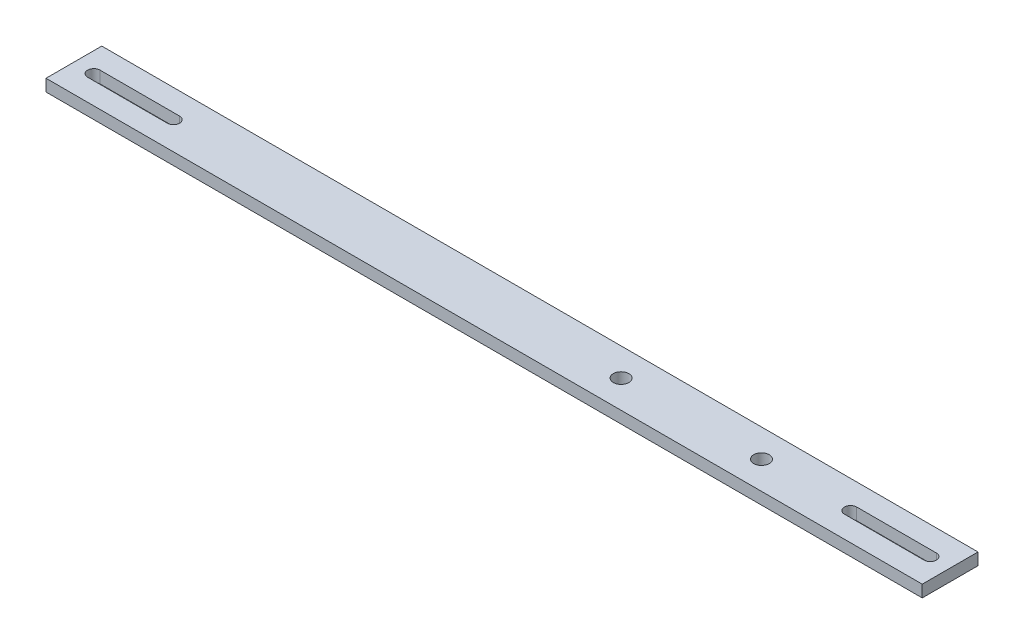
ISO-10303-21;
HEADER;
FILE_DESCRIPTION(('STEP AP214'),'2;1');
FILE_NAME('part.step','',(''),(''),'','','');
FILE_SCHEMA(('AUTOMOTIVE_DESIGN { 1 0 10303 214 1 1 1 1 }'));
ENDSEC;
DATA;
#1=APPLICATION_CONTEXT('core data for automotive mechanical design processes');
#2=APPLICATION_PROTOCOL_DEFINITION('international standard','automotive_design',2000,#1);
#3=PRODUCT_CONTEXT('',#1,'mechanical');
#4=PRODUCT('Part','Part','',(#3));
#5=PRODUCT_RELATED_PRODUCT_CATEGORY('part','',(#4));
#6=PRODUCT_DEFINITION_FORMATION('','',#4);
#7=PRODUCT_DEFINITION_CONTEXT('part definition',#1,'design');
#8=PRODUCT_DEFINITION('design','',#6,#7);
#9=PRODUCT_DEFINITION_SHAPE('','',#8);
#10=(LENGTH_UNIT() NAMED_UNIT(*) SI_UNIT(.MILLI.,.METRE.));
#11=(NAMED_UNIT(*) PLANE_ANGLE_UNIT() SI_UNIT($,.RADIAN.));
#12=(NAMED_UNIT(*) SI_UNIT($,.STERADIAN.) SOLID_ANGLE_UNIT());
#13=UNCERTAINTY_MEASURE_WITH_UNIT(LENGTH_MEASURE(1.E-05),#10,'distance_accuracy_value','');
#14=(GEOMETRIC_REPRESENTATION_CONTEXT(3) GLOBAL_UNCERTAINTY_ASSIGNED_CONTEXT((#13)) GLOBAL_UNIT_ASSIGNED_CONTEXT((#10,
#11,#12)) REPRESENTATION_CONTEXT('',''));
#15=CARTESIAN_POINT('',(0.,0.,0.));
#16=DIRECTION('',(0.,0.,1.));
#17=DIRECTION('',(1.,0.,0.));
#18=AXIS2_PLACEMENT_3D('',#15,#16,#17);
#19=CARTESIAN_POINT('',(0.,3.,0.));
#20=DIRECTION('',(0.,-1.,0.));
#21=DIRECTION('',(0.,0.,-1.));
#22=AXIS2_PLACEMENT_3D('',#19,#20,#21);
#23=PLANE('',#22);
#24=CARTESIAN_POINT('',(62.633,3.,0.));
#25=DIRECTION('',(0.,1.,0.));
#26=DIRECTION('',(0.,0.,1.));
#27=AXIS2_PLACEMENT_3D('',#24,#25,#26);
#28=CIRCLE('',#27,1.95);
#29=CARTESIAN_POINT('',(62.633,3.,1.95));
#30=VERTEX_POINT('',#29);
#31=EDGE_CURVE('E156',#30,#30,#28,.T.);
#32=ORIENTED_EDGE('',*,*,#31,.F.);
#33=EDGE_LOOP('',(#32));
#34=FACE_BOUND('',#33,.T.);
#35=CARTESIAN_POINT('',(27.383,3.,0.));
#36=DIRECTION('',(0.,1.,0.));
#37=DIRECTION('',(0.,0.,1.));
#38=AXIS2_PLACEMENT_3D('',#35,#36,#37);
#39=CIRCLE('',#38,1.95);
#40=CARTESIAN_POINT('',(27.383,3.,1.95000000000001));
#41=VERTEX_POINT('',#40);
#42=EDGE_CURVE('E320',#41,#41,#39,.T.);
#43=ORIENTED_EDGE('',*,*,#42,.F.);
#44=EDGE_LOOP('',(#43));
#45=FACE_BOUND('',#44,.T.);
#46=DIRECTION('',(0.,0.,1.));
#47=VECTOR('',#46,1.);
#48=CARTESIAN_POINT('',(-110.,3.,7.00000000000002));
#49=LINE('',#48,#47);
#50=CARTESIAN_POINT('',(-110.,3.,-6.99999999999998));
#51=VERTEX_POINT('',#50);
#52=CARTESIAN_POINT('',(-110.,3.,7.00000000000002));
#53=VERTEX_POINT('',#52);
#54=EDGE_CURVE('E198',#51,#53,#49,.T.);
#55=ORIENTED_EDGE('',*,*,#54,.T.);
#56=DIRECTION('',(1.,0.,0.));
#57=VECTOR('',#56,1.);
#58=CARTESIAN_POINT('',(-110.,3.,7.00000000000002));
#59=LINE('',#58,#57);
#60=CARTESIAN_POINT('',(110.,3.,7.00000000000001));
#61=VERTEX_POINT('',#60);
#62=EDGE_CURVE('E201',#53,#61,#59,.T.);
#63=ORIENTED_EDGE('',*,*,#62,.T.);
#64=DIRECTION('',(0.,0.,-1.));
#65=VECTOR('',#64,1.);
#66=CARTESIAN_POINT('',(110.,3.,7.00000000000001));
#67=LINE('',#66,#65);
#68=CARTESIAN_POINT('',(110.,3.,-7.00000000000001));
#69=VERTEX_POINT('',#68);
#70=EDGE_CURVE('E204',#61,#69,#67,.T.);
#71=ORIENTED_EDGE('',*,*,#70,.T.);
#72=DIRECTION('',(-1.,0.,0.));
#73=VECTOR('',#72,1.);
#74=CARTESIAN_POINT('',(-110.,3.,-6.99999999999998));
#75=LINE('',#74,#73);
#76=EDGE_CURVE('E206',#69,#51,#75,.T.);
#77=ORIENTED_EDGE('',*,*,#76,.T.);
#78=EDGE_LOOP('',(#55,#63,#71,#77));
#79=FACE_BOUND('',#78,.T.);
#80=DIRECTION('',(1.,0.,0.));
#81=VECTOR('',#80,1.);
#82=CARTESIAN_POINT('',(85.,3.,1.54999999999999));
#83=LINE('',#82,#81);
#84=CARTESIAN_POINT('',(85.,3.,1.54999999999999));
#85=VERTEX_POINT('',#84);
#86=CARTESIAN_POINT('',(105.,3.,1.55));
#87=VERTEX_POINT('',#86);
#88=EDGE_CURVE('E181',#85,#87,#83,.T.);
#89=ORIENTED_EDGE('',*,*,#88,.F.);
#90=CARTESIAN_POINT('',(85.,3.,0.));
#91=DIRECTION('',(0.,1.,0.));
#92=DIRECTION('',(0.,0.,1.));
#93=AXIS2_PLACEMENT_3D('',#90,#91,#92);
#94=CIRCLE('',#93,1.55);
#95=CARTESIAN_POINT('',(85.,3.,-1.55000000000001));
#96=VERTEX_POINT('',#95);
#97=EDGE_CURVE('E162',#96,#85,#94,.T.);
#98=ORIENTED_EDGE('',*,*,#97,.F.);
#99=DIRECTION('',(-1.,0.,0.));
#100=VECTOR('',#99,1.);
#101=CARTESIAN_POINT('',(85.,3.,-1.55000000000001));
#102=LINE('',#101,#100);
#103=CARTESIAN_POINT('',(105.,3.,-1.55));
#104=VERTEX_POINT('',#103);
#105=EDGE_CURVE('E170',#104,#96,#102,.T.);
#106=ORIENTED_EDGE('',*,*,#105,.F.);
#107=CARTESIAN_POINT('',(105.,3.,0.));
#108=DIRECTION('',(0.,1.,0.));
#109=DIRECTION('',(0.,0.,1.));
#110=AXIS2_PLACEMENT_3D('',#107,#108,#109);
#111=CIRCLE('',#110,1.55);
#112=EDGE_CURVE('E184',#87,#104,#111,.T.);
#113=ORIENTED_EDGE('',*,*,#112,.F.);
#114=EDGE_LOOP('',(#89,#98,#106,#113));
#115=FACE_BOUND('',#114,.T.);
#116=CARTESIAN_POINT('',(-85.,3.,0.));
#117=DIRECTION('',(0.,-1.,0.));
#118=DIRECTION('',(0.,0.,1.));
#119=AXIS2_PLACEMENT_3D('',#116,#117,#118);
#120=CIRCLE('',#119,1.55);
#121=CARTESIAN_POINT('',(-85.,3.,-1.55000000000001));
#122=VERTEX_POINT('',#121);
#123=CARTESIAN_POINT('',(-85.,3.,1.54999999999999));
#124=VERTEX_POINT('',#123);
#125=EDGE_CURVE('E53',#122,#124,#120,.T.);
#126=ORIENTED_EDGE('',*,*,#125,.T.);
#127=DIRECTION('',(-1.,0.,0.));
#128=VECTOR('',#127,1.);
#129=CARTESIAN_POINT('',(-85.,3.,1.54999999999999));
#130=LINE('',#129,#128);
#131=CARTESIAN_POINT('',(-105.,3.,1.55));
#132=VERTEX_POINT('',#131);
#133=EDGE_CURVE('E143',#124,#132,#130,.T.);
#134=ORIENTED_EDGE('',*,*,#133,.T.);
#135=CARTESIAN_POINT('',(-105.,3.,0.));
#136=DIRECTION('',(0.,-1.,0.));
#137=DIRECTION('',(0.,0.,1.));
#138=AXIS2_PLACEMENT_3D('',#135,#136,#137);
#139=CIRCLE('',#138,1.55);
#140=CARTESIAN_POINT('',(-105.,3.,-1.55));
#141=VERTEX_POINT('',#140);
#142=EDGE_CURVE('E146',#132,#141,#139,.T.);
#143=ORIENTED_EDGE('',*,*,#142,.T.);
#144=DIRECTION('',(1.,0.,0.));
#145=VECTOR('',#144,1.);
#146=CARTESIAN_POINT('',(-85.,3.,-1.55000000000001));
#147=LINE('',#146,#145);
#148=EDGE_CURVE('E155',#141,#122,#147,.T.);
#149=ORIENTED_EDGE('',*,*,#148,.T.);
#150=EDGE_LOOP('',(#126,#134,#143,#149));
#151=FACE_BOUND('',#150,.T.);
#152=ADVANCED_FACE('F38',(#34,#45,#79,#115,#151),#23,.F.);
#153=CARTESIAN_POINT('',(0.,0.,0.));
#154=DIRECTION('',(0.,-1.,0.));
#155=DIRECTION('',(0.,0.,-1.));
#156=AXIS2_PLACEMENT_3D('',#153,#154,#155);
#157=PLANE('',#156);
#158=CARTESIAN_POINT('',(62.633,0.,0.));
#159=DIRECTION('',(0.,-1.,0.));
#160=DIRECTION('',(0.,0.,-1.));
#161=AXIS2_PLACEMENT_3D('',#158,#159,#160);
#162=CIRCLE('',#161,1.95);
#163=CARTESIAN_POINT('',(62.633,0.,1.95));
#164=VERTEX_POINT('',#163);
#165=EDGE_CURVE('E317',#164,#164,#162,.F.);
#166=ORIENTED_EDGE('',*,*,#165,.T.);
#167=EDGE_LOOP('',(#166));
#168=FACE_BOUND('',#167,.T.);
#169=CARTESIAN_POINT('',(27.383,0.,0.));
#170=DIRECTION('',(0.,-1.,0.));
#171=DIRECTION('',(0.,0.,-1.));
#172=AXIS2_PLACEMENT_3D('',#169,#170,#171);
#173=CIRCLE('',#172,1.95);
#174=CARTESIAN_POINT('',(27.383,0.,1.95000000000001));
#175=VERTEX_POINT('',#174);
#176=EDGE_CURVE('E149',#175,#175,#173,.F.);
#177=ORIENTED_EDGE('',*,*,#176,.T.);
#178=EDGE_LOOP('',(#177));
#179=FACE_BOUND('',#178,.T.);
#180=CARTESIAN_POINT('',(85.,0.,0.));
#181=DIRECTION('',(0.,1.,0.));
#182=DIRECTION('',(0.,0.,1.));
#183=AXIS2_PLACEMENT_3D('',#180,#181,#182);
#184=CIRCLE('',#183,1.55);
#185=CARTESIAN_POINT('',(85.,0.,-1.55000000000001));
#186=VERTEX_POINT('',#185);
#187=CARTESIAN_POINT('',(85.,0.,1.54999999999999));
#188=VERTEX_POINT('',#187);
#189=EDGE_CURVE('E166',#186,#188,#184,.T.);
#190=ORIENTED_EDGE('',*,*,#189,.T.);
#191=DIRECTION('',(1.,0.,0.));
#192=VECTOR('',#191,1.);
#193=CARTESIAN_POINT('',(85.,0.,1.54999999999999));
#194=LINE('',#193,#192);
#195=CARTESIAN_POINT('',(105.,0.,1.55));
#196=VERTEX_POINT('',#195);
#197=EDGE_CURVE('E169',#188,#196,#194,.T.);
#198=ORIENTED_EDGE('',*,*,#197,.T.);
#199=CARTESIAN_POINT('',(105.,0.,0.));
#200=DIRECTION('',(0.,1.,0.));
#201=DIRECTION('',(0.,0.,1.));
#202=AXIS2_PLACEMENT_3D('',#199,#200,#201);
#203=CIRCLE('',#202,1.55);
#204=CARTESIAN_POINT('',(105.,0.,-1.55));
#205=VERTEX_POINT('',#204);
#206=EDGE_CURVE('E173',#196,#205,#203,.T.);
#207=ORIENTED_EDGE('',*,*,#206,.T.);
#208=DIRECTION('',(-1.,0.,0.));
#209=VECTOR('',#208,1.);
#210=CARTESIAN_POINT('',(85.,0.,-1.55000000000001));
#211=LINE('',#210,#209);
#212=EDGE_CURVE('E176',#205,#186,#211,.T.);
#213=ORIENTED_EDGE('',*,*,#212,.T.);
#214=EDGE_LOOP('',(#190,#198,#207,#213));
#215=FACE_BOUND('',#214,.T.);
#216=DIRECTION('',(0.,0.,1.));
#217=VECTOR('',#216,1.);
#218=CARTESIAN_POINT('',(-110.,0.,7.00000000000002));
#219=LINE('',#218,#217);
#220=CARTESIAN_POINT('',(-110.,0.,-6.99999999999998));
#221=VERTEX_POINT('',#220);
#222=CARTESIAN_POINT('',(-110.,0.,7.00000000000002));
#223=VERTEX_POINT('',#222);
#224=EDGE_CURVE('E191',#221,#223,#219,.T.);
#225=ORIENTED_EDGE('',*,*,#224,.F.);
#226=DIRECTION('',(-1.,0.,0.));
#227=VECTOR('',#226,1.);
#228=CARTESIAN_POINT('',(-110.,0.,-6.99999999999998));
#229=LINE('',#228,#227);
#230=CARTESIAN_POINT('',(110.,0.,-7.00000000000001));
#231=VERTEX_POINT('',#230);
#232=EDGE_CURVE('E202',#231,#221,#229,.T.);
#233=ORIENTED_EDGE('',*,*,#232,.F.);
#234=DIRECTION('',(0.,0.,-1.));
#235=VECTOR('',#234,1.);
#236=CARTESIAN_POINT('',(110.,0.,7.00000000000001));
#237=LINE('',#236,#235);
#238=CARTESIAN_POINT('',(110.,0.,7.00000000000001));
#239=VERTEX_POINT('',#238);
#240=EDGE_CURVE('E213',#239,#231,#237,.T.);
#241=ORIENTED_EDGE('',*,*,#240,.F.);
#242=DIRECTION('',(1.,0.,0.));
#243=VECTOR('',#242,1.);
#244=CARTESIAN_POINT('',(-110.,0.,7.00000000000002));
#245=LINE('',#244,#243);
#246=EDGE_CURVE('E211',#223,#239,#245,.T.);
#247=ORIENTED_EDGE('',*,*,#246,.F.);
#248=EDGE_LOOP('',(#225,#233,#241,#247));
#249=FACE_BOUND('',#248,.T.);
#250=DIRECTION('',(-1.,0.,0.));
#251=VECTOR('',#250,1.);
#252=CARTESIAN_POINT('',(-85.,0.,1.54999999999999));
#253=LINE('',#252,#251);
#254=CARTESIAN_POINT('',(-85.,0.,1.54999999999999));
#255=VERTEX_POINT('',#254);
#256=CARTESIAN_POINT('',(-105.,0.,1.55));
#257=VERTEX_POINT('',#256);
#258=EDGE_CURVE('E139',#255,#257,#253,.T.);
#259=ORIENTED_EDGE('',*,*,#258,.F.);
#260=CARTESIAN_POINT('',(-85.,0.,0.));
#261=DIRECTION('',(0.,-1.,0.));
#262=DIRECTION('',(0.,0.,1.));
#263=AXIS2_PLACEMENT_3D('',#260,#261,#262);
#264=CIRCLE('',#263,1.55);
#265=CARTESIAN_POINT('',(-85.,0.,-1.55000000000001));
#266=VERTEX_POINT('',#265);
#267=EDGE_CURVE('E135',#266,#255,#264,.T.);
#268=ORIENTED_EDGE('',*,*,#267,.F.);
#269=DIRECTION('',(1.,0.,0.));
#270=VECTOR('',#269,1.);
#271=CARTESIAN_POINT('',(-85.,0.,-1.55000000000001));
#272=LINE('',#271,#270);
#273=CARTESIAN_POINT('',(-105.,0.,-1.55));
#274=VERTEX_POINT('',#273);
#275=EDGE_CURVE('E127',#274,#266,#272,.T.);
#276=ORIENTED_EDGE('',*,*,#275,.F.);
#277=CARTESIAN_POINT('',(-105.,0.,0.));
#278=DIRECTION('',(0.,-1.,0.));
#279=DIRECTION('',(0.,0.,1.));
#280=AXIS2_PLACEMENT_3D('',#277,#278,#279);
#281=CIRCLE('',#280,1.55);
#282=EDGE_CURVE('E134',#257,#274,#281,.T.);
#283=ORIENTED_EDGE('',*,*,#282,.F.);
#284=EDGE_LOOP('',(#259,#268,#276,#283));
#285=FACE_BOUND('',#284,.T.);
#286=ADVANCED_FACE('F142',(#168,#179,#215,#249,#285),#157,.T.);
#287=CARTESIAN_POINT('',(-110.,3.,7.00000000000002));
#288=DIRECTION('',(1.,0.,0.));
#289=DIRECTION('',(0.,0.,-1.));
#290=AXIS2_PLACEMENT_3D('',#287,#288,#289);
#291=PLANE('',#290);
#292=ORIENTED_EDGE('',*,*,#224,.T.);
#293=DIRECTION('',(0.,-1.,0.));
#294=VECTOR('',#293,1.);
#295=CARTESIAN_POINT('',(-110.,3.,7.00000000000002));
#296=LINE('',#295,#294);
#297=EDGE_CURVE('E11',#53,#223,#296,.T.);
#298=ORIENTED_EDGE('',*,*,#297,.F.);
#299=ORIENTED_EDGE('',*,*,#54,.F.);
#300=DIRECTION('',(0.,-1.,0.));
#301=VECTOR('',#300,1.);
#302=CARTESIAN_POINT('',(-110.,3.,-6.99999999999998));
#303=LINE('',#302,#301);
#304=EDGE_CURVE('E208',#51,#221,#303,.T.);
#305=ORIENTED_EDGE('',*,*,#304,.T.);
#306=EDGE_LOOP('',(#292,#298,#299,#305));
#307=FACE_BOUND('',#306,.T.);
#308=ADVANCED_FACE('F40',(#307),#291,.F.);
#309=CARTESIAN_POINT('',(-110.,3.,7.00000000000002));
#310=DIRECTION('',(0.,0.,-1.));
#311=DIRECTION('',(-1.,0.,0.));
#312=AXIS2_PLACEMENT_3D('',#309,#310,#311);
#313=PLANE('',#312);
#314=ORIENTED_EDGE('',*,*,#246,.T.);
#315=DIRECTION('',(0.,-1.,0.));
#316=VECTOR('',#315,1.);
#317=CARTESIAN_POINT('',(110.,3.,7.00000000000001));
#318=LINE('',#317,#316);
#319=EDGE_CURVE('E46',#61,#239,#318,.T.);
#320=ORIENTED_EDGE('',*,*,#319,.F.);
#321=ORIENTED_EDGE('',*,*,#62,.F.);
#322=ORIENTED_EDGE('',*,*,#297,.T.);
#323=EDGE_LOOP('',(#314,#320,#321,#322));
#324=FACE_BOUND('',#323,.T.);
#325=ADVANCED_FACE('F240',(#324),#313,.F.);
#326=CARTESIAN_POINT('',(110.,3.,7.00000000000001));
#327=DIRECTION('',(-1.,0.,0.));
#328=DIRECTION('',(0.,0.,1.));
#329=AXIS2_PLACEMENT_3D('',#326,#327,#328);
#330=PLANE('',#329);
#331=ORIENTED_EDGE('',*,*,#240,.T.);
#332=DIRECTION('',(0.,-1.,0.));
#333=VECTOR('',#332,1.);
#334=CARTESIAN_POINT('',(110.,3.,-7.00000000000001));
#335=LINE('',#334,#333);
#336=EDGE_CURVE('E218',#69,#231,#335,.T.);
#337=ORIENTED_EDGE('',*,*,#336,.F.);
#338=ORIENTED_EDGE('',*,*,#70,.F.);
#339=ORIENTED_EDGE('',*,*,#319,.T.);
#340=EDGE_LOOP('',(#331,#337,#338,#339));
#341=FACE_BOUND('',#340,.T.);
#342=ADVANCED_FACE('F225',(#341),#330,.F.);
#343=CARTESIAN_POINT('',(-110.,3.,-6.99999999999998));
#344=DIRECTION('',(0.,0.,1.));
#345=DIRECTION('',(1.,0.,0.));
#346=AXIS2_PLACEMENT_3D('',#343,#344,#345);
#347=PLANE('',#346);
#348=ORIENTED_EDGE('',*,*,#232,.T.);
#349=ORIENTED_EDGE('',*,*,#304,.F.);
#350=ORIENTED_EDGE('',*,*,#76,.F.);
#351=ORIENTED_EDGE('',*,*,#336,.T.);
#352=EDGE_LOOP('',(#348,#349,#350,#351));
#353=FACE_BOUND('',#352,.T.);
#354=ADVANCED_FACE('F233',(#353),#347,.F.);
#355=CARTESIAN_POINT('',(85.,0.,0.));
#356=DIRECTION('',(0.,1.,0.));
#357=DIRECTION('',(0.,0.,1.));
#358=AXIS2_PLACEMENT_3D('',#355,#356,#357);
#359=CYLINDRICAL_SURFACE('',#358,1.55);
#360=ORIENTED_EDGE('',*,*,#97,.T.);
#361=DIRECTION('',(0.,1.,0.));
#362=VECTOR('',#361,1.);
#363=CARTESIAN_POINT('',(85.,0.,1.54999999999999));
#364=LINE('',#363,#362);
#365=EDGE_CURVE('E179',#188,#85,#364,.T.);
#366=ORIENTED_EDGE('',*,*,#365,.F.);
#367=ORIENTED_EDGE('',*,*,#189,.F.);
#368=DIRECTION('',(0.,1.,0.));
#369=VECTOR('',#368,1.);
#370=CARTESIAN_POINT('',(85.,0.,-1.55000000000001));
#371=LINE('',#370,#369);
#372=EDGE_CURVE('E189',#186,#96,#371,.T.);
#373=ORIENTED_EDGE('',*,*,#372,.T.);
#374=EDGE_LOOP('',(#360,#366,#367,#373));
#375=FACE_BOUND('',#374,.T.);
#376=ADVANCED_FACE('F259',(#375),#359,.F.);
#377=CARTESIAN_POINT('',(85.,0.,-1.55000000000001));
#378=DIRECTION('',(0.,0.,-1.));
#379=DIRECTION('',(-1.,0.,0.));
#380=AXIS2_PLACEMENT_3D('',#377,#378,#379);
#381=PLANE('',#380);
#382=ORIENTED_EDGE('',*,*,#105,.T.);
#383=ORIENTED_EDGE('',*,*,#372,.F.);
#384=ORIENTED_EDGE('',*,*,#212,.F.);
#385=DIRECTION('',(0.,1.,0.));
#386=VECTOR('',#385,1.);
#387=CARTESIAN_POINT('',(105.,0.,-1.55));
#388=LINE('',#387,#386);
#389=EDGE_CURVE('E192',#205,#104,#388,.T.);
#390=ORIENTED_EDGE('',*,*,#389,.T.);
#391=EDGE_LOOP('',(#382,#383,#384,#390));
#392=FACE_BOUND('',#391,.T.);
#393=ADVANCED_FACE('F266',(#392),#381,.F.);
#394=CARTESIAN_POINT('',(105.,0.,0.));
#395=DIRECTION('',(0.,1.,0.));
#396=DIRECTION('',(0.,0.,1.));
#397=AXIS2_PLACEMENT_3D('',#394,#395,#396);
#398=CYLINDRICAL_SURFACE('',#397,1.55);
#399=ORIENTED_EDGE('',*,*,#112,.T.);
#400=ORIENTED_EDGE('',*,*,#389,.F.);
#401=ORIENTED_EDGE('',*,*,#206,.F.);
#402=DIRECTION('',(0.,1.,0.));
#403=VECTOR('',#402,1.);
#404=CARTESIAN_POINT('',(105.,0.,1.55));
#405=LINE('',#404,#403);
#406=EDGE_CURVE('E194',#196,#87,#405,.T.);
#407=ORIENTED_EDGE('',*,*,#406,.T.);
#408=EDGE_LOOP('',(#399,#400,#401,#407));
#409=FACE_BOUND('',#408,.T.);
#410=ADVANCED_FACE('F271',(#409),#398,.F.);
#411=CARTESIAN_POINT('',(85.,0.,1.54999999999999));
#412=DIRECTION('',(0.,0.,1.));
#413=DIRECTION('',(1.,0.,0.));
#414=AXIS2_PLACEMENT_3D('',#411,#412,#413);
#415=PLANE('',#414);
#416=ORIENTED_EDGE('',*,*,#88,.T.);
#417=ORIENTED_EDGE('',*,*,#406,.F.);
#418=ORIENTED_EDGE('',*,*,#197,.F.);
#419=ORIENTED_EDGE('',*,*,#365,.T.);
#420=EDGE_LOOP('',(#416,#417,#418,#419));
#421=FACE_BOUND('',#420,.T.);
#422=ADVANCED_FACE('F280',(#421),#415,.F.);
#423=CARTESIAN_POINT('',(-85.,0.,0.));
#424=DIRECTION('',(0.,1.,0.));
#425=DIRECTION('',(0.,0.,1.));
#426=AXIS2_PLACEMENT_3D('',#423,#424,#425);
#427=CYLINDRICAL_SURFACE('',#426,1.55);
#428=ORIENTED_EDGE('',*,*,#125,.F.);
#429=DIRECTION('',(0.,1.,0.));
#430=VECTOR('',#429,1.);
#431=CARTESIAN_POINT('',(-85.,0.,-1.55000000000001));
#432=LINE('',#431,#430);
#433=EDGE_CURVE('E129',#266,#122,#432,.T.);
#434=ORIENTED_EDGE('',*,*,#433,.F.);
#435=ORIENTED_EDGE('',*,*,#267,.T.);
#436=DIRECTION('',(0.,1.,0.));
#437=VECTOR('',#436,1.);
#438=CARTESIAN_POINT('',(-85.,0.,1.54999999999999));
#439=LINE('',#438,#437);
#440=EDGE_CURVE('E160',#255,#124,#439,.T.);
#441=ORIENTED_EDGE('',*,*,#440,.T.);
#442=EDGE_LOOP('',(#428,#434,#435,#441));
#443=FACE_BOUND('',#442,.T.);
#444=ADVANCED_FACE('F137',(#443),#427,.F.);
#445=CARTESIAN_POINT('',(-85.,0.,1.54999999999999));
#446=DIRECTION('',(0.,0.,-1.));
#447=DIRECTION('',(-1.,0.,0.));
#448=AXIS2_PLACEMENT_3D('',#445,#446,#447);
#449=PLANE('',#448);
#450=ORIENTED_EDGE('',*,*,#133,.F.);
#451=ORIENTED_EDGE('',*,*,#440,.F.);
#452=ORIENTED_EDGE('',*,*,#258,.T.);
#453=DIRECTION('',(0.,1.,0.));
#454=VECTOR('',#453,1.);
#455=CARTESIAN_POINT('',(-105.,0.,1.55));
#456=LINE('',#455,#454);
#457=EDGE_CURVE('E163',#257,#132,#456,.T.);
#458=ORIENTED_EDGE('',*,*,#457,.T.);
#459=EDGE_LOOP('',(#450,#451,#452,#458));
#460=FACE_BOUND('',#459,.T.);
#461=ADVANCED_FACE('F295',(#460),#449,.T.);
#462=CARTESIAN_POINT('',(-105.,0.,0.));
#463=DIRECTION('',(0.,1.,0.));
#464=DIRECTION('',(0.,0.,1.));
#465=AXIS2_PLACEMENT_3D('',#462,#463,#464);
#466=CYLINDRICAL_SURFACE('',#465,1.55);
#467=ORIENTED_EDGE('',*,*,#142,.F.);
#468=ORIENTED_EDGE('',*,*,#457,.F.);
#469=ORIENTED_EDGE('',*,*,#282,.T.);
#470=DIRECTION('',(0.,1.,0.));
#471=VECTOR('',#470,1.);
#472=CARTESIAN_POINT('',(-105.,0.,-1.55));
#473=LINE('',#472,#471);
#474=EDGE_CURVE('E61',#274,#141,#473,.T.);
#475=ORIENTED_EDGE('',*,*,#474,.T.);
#476=EDGE_LOOP('',(#467,#468,#469,#475));
#477=FACE_BOUND('',#476,.T.);
#478=ADVANCED_FACE('F299',(#477),#466,.F.);
#479=CARTESIAN_POINT('',(-85.,0.,-1.55000000000001));
#480=DIRECTION('',(0.,0.,1.));
#481=DIRECTION('',(1.,0.,0.));
#482=AXIS2_PLACEMENT_3D('',#479,#480,#481);
#483=PLANE('',#482);
#484=ORIENTED_EDGE('',*,*,#148,.F.);
#485=ORIENTED_EDGE('',*,*,#474,.F.);
#486=ORIENTED_EDGE('',*,*,#275,.T.);
#487=ORIENTED_EDGE('',*,*,#433,.T.);
#488=EDGE_LOOP('',(#484,#485,#486,#487));
#489=FACE_BOUND('',#488,.T.);
#490=ADVANCED_FACE('F128',(#489),#483,.T.);
#491=CARTESIAN_POINT('',(27.383,-0.00100000000000013,0.));
#492=DIRECTION('',(0.,1.,0.));
#493=DIRECTION('',(0.,0.,1.));
#494=AXIS2_PLACEMENT_3D('',#491,#492,#493);
#495=CYLINDRICAL_SURFACE('',#494,1.95);
#496=CARTESIAN_POINT('',(27.383,0.,1.95000000000001));
#497=CARTESIAN_POINT('',(27.383,0.03125,1.95000000000001));
#498=CARTESIAN_POINT('',(27.383,0.0625,1.95000000000001));
#499=CARTESIAN_POINT('',(27.383,0.125,1.95000000000001));
#500=CARTESIAN_POINT('',(27.383,0.15625,1.95000000000001));
#501=CARTESIAN_POINT('',(27.383,0.21875,1.95000000000001));
#502=CARTESIAN_POINT('',(27.383,0.25,1.95000000000001));
#503=CARTESIAN_POINT('',(27.383,0.3125,1.95000000000001));
#504=CARTESIAN_POINT('',(27.383,0.34375,1.95000000000001));
#505=CARTESIAN_POINT('',(27.383,0.40625,1.95000000000001));
#506=CARTESIAN_POINT('',(27.383,0.4375,1.95000000000001));
#507=CARTESIAN_POINT('',(27.383,0.5,1.95000000000001));
#508=CARTESIAN_POINT('',(27.383,0.53125,1.95000000000001));
#509=CARTESIAN_POINT('',(27.383,0.59375,1.95000000000001));
#510=CARTESIAN_POINT('',(27.383,0.625,1.95000000000001));
#511=CARTESIAN_POINT('',(27.383,0.6875,1.95000000000001));
#512=CARTESIAN_POINT('',(27.383,0.71875,1.95000000000001));
#513=CARTESIAN_POINT('',(27.383,0.78125,1.95000000000001));
#514=CARTESIAN_POINT('',(27.383,0.8125,1.95000000000001));
#515=CARTESIAN_POINT('',(27.383,0.875,1.95000000000001));
#516=CARTESIAN_POINT('',(27.383,0.90625,1.95000000000001));
#517=CARTESIAN_POINT('',(27.383,0.96875,1.95000000000001));
#518=CARTESIAN_POINT('',(27.383,1.,1.95000000000001));
#519=CARTESIAN_POINT('',(27.383,1.0625,1.95000000000001));
#520=CARTESIAN_POINT('',(27.383,1.09375,1.95000000000001));
#521=CARTESIAN_POINT('',(27.383,1.15625,1.95000000000001));
#522=CARTESIAN_POINT('',(27.383,1.1875,1.95000000000001));
#523=CARTESIAN_POINT('',(27.383,1.25,1.95000000000001));
#524=CARTESIAN_POINT('',(27.383,1.28125,1.95000000000001));
#525=CARTESIAN_POINT('',(27.383,1.34375,1.95000000000001));
#526=CARTESIAN_POINT('',(27.383,1.375,1.95000000000001));
#527=CARTESIAN_POINT('',(27.383,1.4375,1.95000000000001));
#528=CARTESIAN_POINT('',(27.383,1.46875,1.95000000000001));
#529=CARTESIAN_POINT('',(27.383,1.53125,1.95000000000001));
#530=CARTESIAN_POINT('',(27.383,1.5625,1.95000000000001));
#531=CARTESIAN_POINT('',(27.383,1.625,1.95000000000001));
#532=CARTESIAN_POINT('',(27.383,1.65625,1.95000000000001));
#533=CARTESIAN_POINT('',(27.383,1.71875,1.95000000000001));
#534=CARTESIAN_POINT('',(27.383,1.75,1.95000000000001));
#535=CARTESIAN_POINT('',(27.383,1.8125,1.95000000000001));
#536=CARTESIAN_POINT('',(27.383,1.84375,1.95000000000001));
#537=CARTESIAN_POINT('',(27.383,1.90625,1.95000000000001));
#538=CARTESIAN_POINT('',(27.383,1.9375,1.95000000000001));
#539=CARTESIAN_POINT('',(27.383,2.,1.95000000000001));
#540=CARTESIAN_POINT('',(27.383,2.03125,1.95000000000001));
#541=CARTESIAN_POINT('',(27.383,2.09375,1.95000000000001));
#542=CARTESIAN_POINT('',(27.383,2.125,1.95000000000001));
#543=CARTESIAN_POINT('',(27.383,2.1875,1.95000000000001));
#544=CARTESIAN_POINT('',(27.383,2.21875,1.95000000000001));
#545=CARTESIAN_POINT('',(27.383,2.28125,1.95000000000001));
#546=CARTESIAN_POINT('',(27.383,2.3125,1.95000000000001));
#547=CARTESIAN_POINT('',(27.383,2.375,1.95000000000001));
#548=CARTESIAN_POINT('',(27.383,2.40625,1.95000000000001));
#549=CARTESIAN_POINT('',(27.383,2.46875,1.95000000000001));
#550=CARTESIAN_POINT('',(27.383,2.5,1.95000000000001));
#551=CARTESIAN_POINT('',(27.383,2.5625,1.95000000000001));
#552=CARTESIAN_POINT('',(27.383,2.59375,1.95000000000001));
#553=CARTESIAN_POINT('',(27.383,2.65625,1.95000000000001));
#554=CARTESIAN_POINT('',(27.383,2.6875,1.95000000000001));
#555=CARTESIAN_POINT('',(27.383,2.75,1.95000000000001));
#556=CARTESIAN_POINT('',(27.383,2.78125,1.95000000000001));
#557=CARTESIAN_POINT('',(27.383,2.84375,1.95000000000001));
#558=CARTESIAN_POINT('',(27.383,2.875,1.95000000000001));
#559=CARTESIAN_POINT('',(27.383,2.9375,1.95000000000001));
#560=CARTESIAN_POINT('',(27.383,2.96875,1.95000000000001));
#561=CARTESIAN_POINT('',(27.383,3.,1.95000000000001));
#562=B_SPLINE_CURVE_WITH_KNOTS('',3,(#496,#497,#498,#499,#500,#501,#502,#503,#504,#505,#506,
#507,#508,#509,#510,#511,#512,#513,#514,#515,#516,#517,#518,#519,#520,#521,#522,#523,#524,#525,
#526,#527,#528,#529,#530,#531,#532,#533,#534,#535,#536,#537,#538,#539,#540,#541,#542,#543,#544,
#545,#546,#547,#548,#549,#550,#551,#552,#553,#554,#555,#556,#557,#558,#559,#560,#561),
.UNSPECIFIED.,.F.,.F.,(4,2,2,2,2,2,2,2,2,2,2,2,2,2,2,2,2,2,2,2,2,2,2,2,2,2,2,2,2,2,2,2,4),(0.,
0.09375,0.1875,0.28125,0.375,0.46875,0.5625,0.65625,0.75,0.84375,0.9375,1.03125,1.125,1.21875,
1.3125,1.40625,1.5,1.59375,1.6875,1.78125,1.875,1.96875,2.0625,2.15625,2.25,2.34375,2.4375,
2.53125,2.625,2.71875,2.8125,2.90625,3.),.UNSPECIFIED.);
#563=EDGE_CURVE('BSEAM298',#175,#41,#562,.T.);
#564=ORIENTED_EDGE('',*,*,#176,.F.);
#565=ORIENTED_EDGE('',*,*,#42,.T.);
#566=ORIENTED_EDGE('',*,*,#563,.T.);
#567=ORIENTED_EDGE('',*,*,#563,.F.);
#568=EDGE_LOOP('',(#564,#566,#565,#567));
#569=FACE_BOUND('',#568,.T.);
#570=ADVANCED_FACE('F298',(#569),#495,.F.);
#571=CARTESIAN_POINT('',(62.633,-0.00100000000000013,0.));
#572=DIRECTION('',(0.,1.,0.));
#573=DIRECTION('',(0.,0.,1.));
#574=AXIS2_PLACEMENT_3D('',#571,#572,#573);
#575=CYLINDRICAL_SURFACE('',#574,1.95);
#576=CARTESIAN_POINT('',(62.633,0.,1.95));
#577=CARTESIAN_POINT('',(62.633,0.03125,1.95));
#578=CARTESIAN_POINT('',(62.633,0.0625,1.95));
#579=CARTESIAN_POINT('',(62.633,0.125,1.95));
#580=CARTESIAN_POINT('',(62.633,0.15625,1.95));
#581=CARTESIAN_POINT('',(62.633,0.21875,1.95));
#582=CARTESIAN_POINT('',(62.633,0.25,1.95));
#583=CARTESIAN_POINT('',(62.633,0.3125,1.95));
#584=CARTESIAN_POINT('',(62.633,0.34375,1.95));
#585=CARTESIAN_POINT('',(62.633,0.40625,1.95));
#586=CARTESIAN_POINT('',(62.633,0.4375,1.95));
#587=CARTESIAN_POINT('',(62.633,0.5,1.95));
#588=CARTESIAN_POINT('',(62.633,0.53125,1.95));
#589=CARTESIAN_POINT('',(62.633,0.59375,1.95));
#590=CARTESIAN_POINT('',(62.633,0.625,1.95));
#591=CARTESIAN_POINT('',(62.633,0.6875,1.95));
#592=CARTESIAN_POINT('',(62.633,0.71875,1.95));
#593=CARTESIAN_POINT('',(62.633,0.78125,1.95));
#594=CARTESIAN_POINT('',(62.633,0.8125,1.95));
#595=CARTESIAN_POINT('',(62.633,0.875,1.95));
#596=CARTESIAN_POINT('',(62.633,0.90625,1.95));
#597=CARTESIAN_POINT('',(62.633,0.96875,1.95));
#598=CARTESIAN_POINT('',(62.633,1.,1.95));
#599=CARTESIAN_POINT('',(62.633,1.0625,1.95));
#600=CARTESIAN_POINT('',(62.633,1.09375,1.95));
#601=CARTESIAN_POINT('',(62.633,1.15625,1.95));
#602=CARTESIAN_POINT('',(62.633,1.1875,1.95));
#603=CARTESIAN_POINT('',(62.633,1.25,1.95));
#604=CARTESIAN_POINT('',(62.633,1.28125,1.95));
#605=CARTESIAN_POINT('',(62.633,1.34375,1.95));
#606=CARTESIAN_POINT('',(62.633,1.375,1.95));
#607=CARTESIAN_POINT('',(62.633,1.4375,1.95));
#608=CARTESIAN_POINT('',(62.633,1.46875,1.95));
#609=CARTESIAN_POINT('',(62.633,1.53125,1.95));
#610=CARTESIAN_POINT('',(62.633,1.5625,1.95));
#611=CARTESIAN_POINT('',(62.633,1.625,1.95));
#612=CARTESIAN_POINT('',(62.633,1.65625,1.95));
#613=CARTESIAN_POINT('',(62.633,1.71875,1.95));
#614=CARTESIAN_POINT('',(62.633,1.75,1.95));
#615=CARTESIAN_POINT('',(62.633,1.8125,1.95));
#616=CARTESIAN_POINT('',(62.633,1.84375,1.95));
#617=CARTESIAN_POINT('',(62.633,1.90625,1.95));
#618=CARTESIAN_POINT('',(62.633,1.9375,1.95));
#619=CARTESIAN_POINT('',(62.633,2.,1.95));
#620=CARTESIAN_POINT('',(62.633,2.03125,1.95));
#621=CARTESIAN_POINT('',(62.633,2.09375,1.95));
#622=CARTESIAN_POINT('',(62.633,2.125,1.95));
#623=CARTESIAN_POINT('',(62.633,2.1875,1.95));
#624=CARTESIAN_POINT('',(62.633,2.21875,1.95));
#625=CARTESIAN_POINT('',(62.633,2.28125,1.95));
#626=CARTESIAN_POINT('',(62.633,2.3125,1.95));
#627=CARTESIAN_POINT('',(62.633,2.375,1.95));
#628=CARTESIAN_POINT('',(62.633,2.40625,1.95));
#629=CARTESIAN_POINT('',(62.633,2.46875,1.95));
#630=CARTESIAN_POINT('',(62.633,2.5,1.95));
#631=CARTESIAN_POINT('',(62.633,2.5625,1.95));
#632=CARTESIAN_POINT('',(62.633,2.59375,1.95));
#633=CARTESIAN_POINT('',(62.633,2.65625,1.95));
#634=CARTESIAN_POINT('',(62.633,2.6875,1.95));
#635=CARTESIAN_POINT('',(62.633,2.75,1.95));
#636=CARTESIAN_POINT('',(62.633,2.78125,1.95));
#637=CARTESIAN_POINT('',(62.633,2.84375,1.95));
#638=CARTESIAN_POINT('',(62.633,2.875,1.95));
#639=CARTESIAN_POINT('',(62.633,2.9375,1.95));
#640=CARTESIAN_POINT('',(62.633,2.96875,1.95));
#641=CARTESIAN_POINT('',(62.633,3.,1.95));
#642=B_SPLINE_CURVE_WITH_KNOTS('',3,(#576,#577,#578,#579,#580,#581,#582,#583,#584,#585,#586,
#587,#588,#589,#590,#591,#592,#593,#594,#595,#596,#597,#598,#599,#600,#601,#602,#603,#604,#605,
#606,#607,#608,#609,#610,#611,#612,#613,#614,#615,#616,#617,#618,#619,#620,#621,#622,#623,#624,
#625,#626,#627,#628,#629,#630,#631,#632,#633,#634,#635,#636,#637,#638,#639,#640,#641),
.UNSPECIFIED.,.F.,.F.,(4,2,2,2,2,2,2,2,2,2,2,2,2,2,2,2,2,2,2,2,2,2,2,2,2,2,2,2,2,2,2,2,4),(0.,
0.09375,0.1875,0.28125,0.375,0.46875,0.5625,0.65625,0.75,0.84375,0.9375,1.03125,1.125,1.21875,
1.3125,1.40625,1.5,1.59375,1.6875,1.78125,1.875,1.96875,2.0625,2.15625,2.25,2.34375,2.4375,
2.53125,2.625,2.71875,2.8125,2.90625,3.),.UNSPECIFIED.);
#643=EDGE_CURVE('BSEAM308',#164,#30,#642,.T.);
#644=ORIENTED_EDGE('',*,*,#165,.F.);
#645=ORIENTED_EDGE('',*,*,#31,.T.);
#646=ORIENTED_EDGE('',*,*,#643,.T.);
#647=ORIENTED_EDGE('',*,*,#643,.F.);
#648=EDGE_LOOP('',(#644,#646,#645,#647));
#649=FACE_BOUND('',#648,.T.);
#650=ADVANCED_FACE('F308',(#649),#575,.F.);
#651=CLOSED_SHELL('',(#152,#286,#308,#325,#342,#354,#376,#393,#410,#422,#444,#461,#478,#490,
#570,#650));
#652=MANIFOLD_SOLID_BREP('B2',#651);
#653=ADVANCED_BREP_SHAPE_REPRESENTATION('',(#18,#652),#14);
#654=SHAPE_DEFINITION_REPRESENTATION(#9,#653);
ENDSEC;
END-ISO-10303-21;
